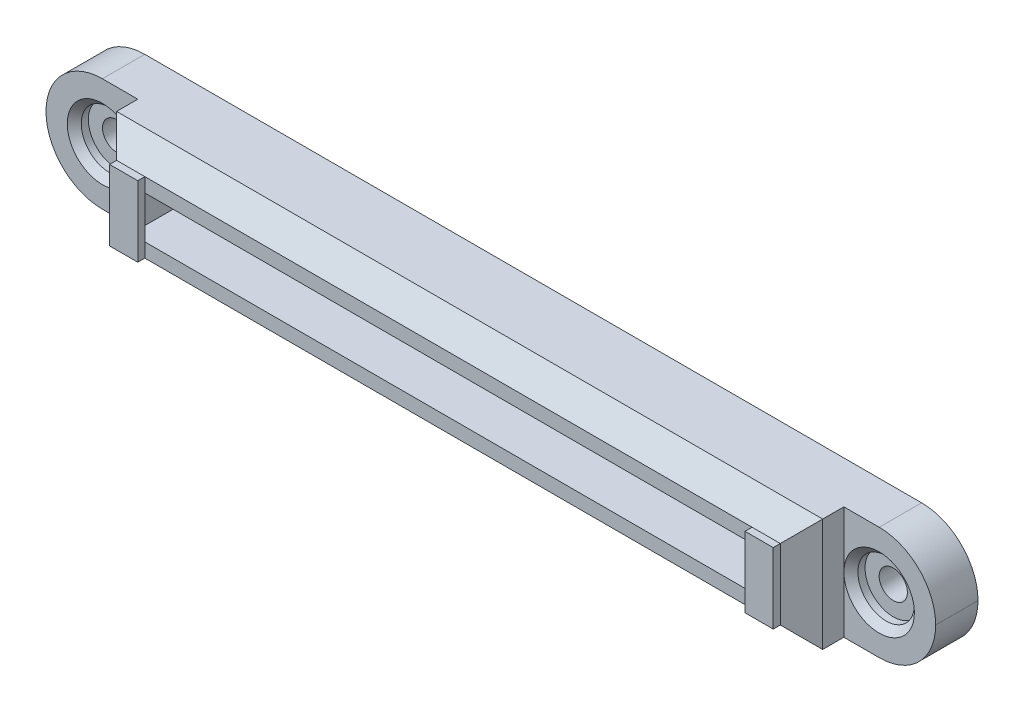
ISO-10303-21;
HEADER;
FILE_DESCRIPTION(('STEP AP214'),'2;1');
FILE_NAME('part.step','',(''),(''),'','','');
FILE_SCHEMA(('AUTOMOTIVE_DESIGN { 1 0 10303 214 1 1 1 1 }'));
ENDSEC;
DATA;
#1=APPLICATION_CONTEXT('core data for automotive mechanical design processes');
#2=APPLICATION_PROTOCOL_DEFINITION('international standard','automotive_design',2000,#1);
#3=PRODUCT_CONTEXT('',#1,'mechanical');
#4=PRODUCT('Part','Part','',(#3));
#5=PRODUCT_RELATED_PRODUCT_CATEGORY('part','',(#4));
#6=PRODUCT_DEFINITION_FORMATION('','',#4);
#7=PRODUCT_DEFINITION_CONTEXT('part definition',#1,'design');
#8=PRODUCT_DEFINITION('design','',#6,#7);
#9=PRODUCT_DEFINITION_SHAPE('','',#8);
#10=(LENGTH_UNIT() NAMED_UNIT(*) SI_UNIT(.MILLI.,.METRE.));
#11=(NAMED_UNIT(*) PLANE_ANGLE_UNIT() SI_UNIT($,.RADIAN.));
#12=(NAMED_UNIT(*) SI_UNIT($,.STERADIAN.) SOLID_ANGLE_UNIT());
#13=UNCERTAINTY_MEASURE_WITH_UNIT(LENGTH_MEASURE(1.E-05),#10,'distance_accuracy_value','');
#14=(GEOMETRIC_REPRESENTATION_CONTEXT(3) GLOBAL_UNCERTAINTY_ASSIGNED_CONTEXT((#13)) GLOBAL_UNIT_ASSIGNED_CONTEXT((#10,
#11,#12)) REPRESENTATION_CONTEXT('',''));
#15=CARTESIAN_POINT('',(0.,0.,0.));
#16=DIRECTION('',(0.,0.,1.));
#17=DIRECTION('',(1.,0.,0.));
#18=AXIS2_PLACEMENT_3D('',#15,#16,#17);
#19=CARTESIAN_POINT('',(-5.,8.,0.));
#20=DIRECTION('',(0.,0.,-1.));
#21=DIRECTION('',(-1.,0.,0.));
#22=AXIS2_PLACEMENT_3D('',#19,#20,#21);
#23=CYLINDRICAL_SURFACE('',#22,2.);
#24=CARTESIAN_POINT('',(-5.00000000001,8.00000000001,0.));
#25=DIRECTION('',(0.,0.,-1.));
#26=DIRECTION('',(-1.,0.,0.));
#27=AXIS2_PLACEMENT_3D('',#24,#25,#26);
#28=CIRCLE('',#27,2.00000000001);
#29=CARTESIAN_POINT('',(-7.00000000002,8.00000000001,0.));
#30=VERTEX_POINT('',#29);
#31=EDGE_CURVE('E11',#30,#30,#28,.T.);
#32=ORIENTED_EDGE('',*,*,#31,.T.);
#33=EDGE_LOOP('',(#32));
#34=FACE_BOUND('',#33,.T.);
#35=CARTESIAN_POINT('',(-5.00000000001,8.00000000001,4.00000000001));
#36=DIRECTION('',(0.,0.,-1.));
#37=DIRECTION('',(-1.,0.,0.));
#38=AXIS2_PLACEMENT_3D('',#35,#36,#37);
#39=CIRCLE('',#38,2.00000000001);
#40=CARTESIAN_POINT('',(-7.00000000002,8.00000000001,4.00000000001));
#41=VERTEX_POINT('',#40);
#42=EDGE_CURVE('E463',#41,#41,#39,.T.);
#43=ORIENTED_EDGE('',*,*,#42,.F.);
#44=EDGE_LOOP('',(#43));
#45=FACE_BOUND('',#44,.T.);
#46=ADVANCED_FACE('F17',(#34,#45),#23,.F.);
#47=CARTESIAN_POINT('',(105.,8.,0.));
#48=DIRECTION('',(0.,0.,-1.));
#49=DIRECTION('',(-1.,0.,0.));
#50=AXIS2_PLACEMENT_3D('',#47,#48,#49);
#51=CYLINDRICAL_SURFACE('',#50,2.);
#52=CARTESIAN_POINT('',(105.00000000001,8.00000000001,0.));
#53=DIRECTION('',(0.,0.,-1.));
#54=DIRECTION('',(-1.,0.,0.));
#55=AXIS2_PLACEMENT_3D('',#52,#53,#54);
#56=CIRCLE('',#55,2.00000000001);
#57=CARTESIAN_POINT('',(103.,8.00000000001,0.));
#58=VERTEX_POINT('',#57);
#59=EDGE_CURVE('E27',#58,#58,#56,.T.);
#60=ORIENTED_EDGE('',*,*,#59,.T.);
#61=EDGE_LOOP('',(#60));
#62=FACE_BOUND('',#61,.T.);
#63=CARTESIAN_POINT('',(105.00000000001,8.00000000001,4.00000000001));
#64=DIRECTION('',(0.,0.,-1.));
#65=DIRECTION('',(-1.,0.,0.));
#66=AXIS2_PLACEMENT_3D('',#63,#64,#65);
#67=CIRCLE('',#66,2.00000000001);
#68=CARTESIAN_POINT('',(103.,8.00000000001,4.00000000001));
#69=VERTEX_POINT('',#68);
#70=EDGE_CURVE('E323',#69,#69,#67,.T.);
#71=ORIENTED_EDGE('',*,*,#70,.F.);
#72=EDGE_LOOP('',(#71));
#73=FACE_BOUND('',#72,.T.);
#74=ADVANCED_FACE('F517',(#62,#73),#51,.F.);
#75=CARTESIAN_POINT('',(-5.,8.,6.));
#76=DIRECTION('',(0.,0.,1.));
#77=DIRECTION('',(1.,0.,0.));
#78=AXIS2_PLACEMENT_3D('',#75,#76,#77);
#79=CYLINDRICAL_SURFACE('',#78,4.);
#80=CARTESIAN_POINT('',(-5.00000000001,8.00000000001,5.01000000001));
#81=DIRECTION('',(0.,0.,-1.));
#82=DIRECTION('',(1.,0.,0.));
#83=AXIS2_PLACEMENT_3D('',#80,#81,#82);
#84=CIRCLE('',#83,4.00000000001);
#85=CARTESIAN_POINT('',(-1.,8.00000000001,5.01000000001));
#86=VERTEX_POINT('',#85);
#87=EDGE_CURVE('E349',#86,#86,#84,.T.);
#88=ORIENTED_EDGE('',*,*,#87,.F.);
#89=EDGE_LOOP('',(#88));
#90=FACE_BOUND('',#89,.T.);
#91=CARTESIAN_POINT('',(-5.00000000001,8.00000000001,4.00000000001));
#92=DIRECTION('',(0.,0.,-1.));
#93=DIRECTION('',(1.,0.,0.));
#94=AXIS2_PLACEMENT_3D('',#91,#92,#93);
#95=CIRCLE('',#94,4.00000000001);
#96=CARTESIAN_POINT('',(-1.,8.00000000001,4.00000000001));
#97=VERTEX_POINT('',#96);
#98=EDGE_CURVE('E438',#97,#97,#95,.T.);
#99=ORIENTED_EDGE('',*,*,#98,.T.);
#100=EDGE_LOOP('',(#99));
#101=FACE_BOUND('',#100,.T.);
#102=ADVANCED_FACE('F513',(#90,#101),#79,.F.);
#103=CARTESIAN_POINT('',(105.,8.,6.));
#104=DIRECTION('',(0.,0.,1.));
#105=DIRECTION('',(1.,0.,0.));
#106=AXIS2_PLACEMENT_3D('',#103,#104,#105);
#107=CYLINDRICAL_SURFACE('',#106,4.);
#108=CARTESIAN_POINT('',(105.00000000001,8.00000000001,5.01000000001));
#109=DIRECTION('',(0.,0.,-1.));
#110=DIRECTION('',(1.,0.,0.));
#111=AXIS2_PLACEMENT_3D('',#108,#109,#110);
#112=CIRCLE('',#111,4.00000000001001);
#113=CARTESIAN_POINT('',(109.00000000002,8.00000000001,5.01000000001));
#114=VERTEX_POINT('',#113);
#115=EDGE_CURVE('E491',#114,#114,#112,.T.);
#116=ORIENTED_EDGE('',*,*,#115,.F.);
#117=EDGE_LOOP('',(#116));
#118=FACE_BOUND('',#117,.T.);
#119=CARTESIAN_POINT('',(105.00000000001,8.00000000001,4.00000000001));
#120=DIRECTION('',(0.,0.,-1.));
#121=DIRECTION('',(1.,0.,0.));
#122=AXIS2_PLACEMENT_3D('',#119,#120,#121);
#123=CIRCLE('',#122,4.00000000001001);
#124=CARTESIAN_POINT('',(109.00000000002,8.00000000001,4.00000000001));
#125=VERTEX_POINT('',#124);
#126=EDGE_CURVE('E433',#125,#125,#123,.T.);
#127=ORIENTED_EDGE('',*,*,#126,.T.);
#128=EDGE_LOOP('',(#127));
#129=FACE_BOUND('',#128,.T.);
#130=ADVANCED_FACE('F516',(#118,#129),#107,.F.);
#131=CARTESIAN_POINT('',(105.,8.,6.00000000002865));
#132=DIRECTION('',(0.,0.,1.));
#133=DIRECTION('',(1.,0.,0.));
#134=AXIS2_PLACEMENT_3D('',#131,#132,#133);
#135=CONICAL_SURFACE('',#134,4.98999999998205,0.785398163426158);
#136=CARTESIAN_POINT('',(105.00000000001,8.00000000001,6.00000000002046));
#137=DIRECTION('',(0.,0.,-1.));
#138=DIRECTION('',(1.,0.,0.));
#139=AXIS2_PLACEMENT_3D('',#136,#137,#138);
#140=CIRCLE('',#139,4.98999999997386);
#141=CARTESIAN_POINT('',(109.989999999984,8.00000000001,6.00000000002046));
#142=VERTEX_POINT('',#141);
#143=EDGE_CURVE('E314',#142,#142,#140,.T.);
#144=ORIENTED_EDGE('',*,*,#143,.F.);
#145=EDGE_LOOP('',(#144));
#146=FACE_BOUND('',#145,.T.);
#147=ORIENTED_EDGE('',*,*,#115,.T.);
#148=EDGE_LOOP('',(#147));
#149=FACE_BOUND('',#148,.T.);
#150=ADVANCED_FACE('F1388',(#146,#149),#135,.F.);
#151=CARTESIAN_POINT('',(-5.,8.,5.99999999997181));
#152=DIRECTION('',(0.,0.,1.));
#153=DIRECTION('',(1.,0.,0.));
#154=AXIS2_PLACEMENT_3D('',#151,#152,#153);
#155=CONICAL_SURFACE('',#154,4.9899999999684,0.785398163368739);
#156=CARTESIAN_POINT('',(-5.00000000001,8.00000000001,5.99999999998181));
#157=DIRECTION('',(0.,0.,1.));
#158=DIRECTION('',(1.,0.,0.));
#159=AXIS2_PLACEMENT_3D('',#156,#157,#158);
#160=CIRCLE('',#159,4.9899999999784);
#161=CARTESIAN_POINT('',(-0.0100000000316002,8.00000000001,5.99999999998181));
#162=VERTEX_POINT('',#161);
#163=EDGE_CURVE('E345',#162,#162,#160,.T.);
#164=ORIENTED_EDGE('',*,*,#163,.T.);
#165=EDGE_LOOP('',(#164));
#166=FACE_BOUND('',#165,.T.);
#167=ORIENTED_EDGE('',*,*,#87,.T.);
#168=EDGE_LOOP('',(#167));
#169=FACE_BOUND('',#168,.T.);
#170=ADVANCED_FACE('F511',(#166,#169),#155,.F.);
#171=CARTESIAN_POINT('',(0.,0.,0.));
#172=DIRECTION('',(0.,0.,1.));
#173=DIRECTION('',(1.,0.,0.));
#174=AXIS2_PLACEMENT_3D('',#171,#172,#173);
#175=PLANE('',#174);
#176=DIRECTION('',(0.,1.,0.));
#177=VECTOR('',#176,1.);
#178=CARTESIAN_POINT('',(-13.00000000001,7.99000000001,0.));
#179=LINE('',#178,#177);
#180=CARTESIAN_POINT('',(-13.,7.99,0.));
#181=VERTEX_POINT('',#180);
#182=CARTESIAN_POINT('',(-13.,8.01,0.));
#183=VERTEX_POINT('',#182);
#184=EDGE_CURVE('E310',#181,#183,#179,.T.);
#185=ORIENTED_EDGE('',*,*,#184,.T.);
#186=CARTESIAN_POINT('',(-5.01000000001,8.01000000001,0.));
#187=DIRECTION('',(0.,0.,1.));
#188=DIRECTION('',(1.,0.,0.));
#189=AXIS2_PLACEMENT_3D('',#186,#187,#188);
#190=CIRCLE('',#189,7.99000000001029);
#191=CARTESIAN_POINT('',(-5.01,16.,0.));
#192=VERTEX_POINT('',#191);
#193=EDGE_CURVE('E42',#192,#183,#190,.T.);
#194=ORIENTED_EDGE('',*,*,#193,.F.);
#195=DIRECTION('',(-1.,0.,0.));
#196=VECTOR('',#195,1.);
#197=CARTESIAN_POINT('',(0.,16.00000000001,0.));
#198=LINE('',#197,#196);
#199=CARTESIAN_POINT('',(105.01,16.,0.));
#200=VERTEX_POINT('',#199);
#201=EDGE_CURVE('E275',#200,#192,#198,.T.);
#202=ORIENTED_EDGE('',*,*,#201,.F.);
#203=CARTESIAN_POINT('',(105.01000000001,8.01000000000999,0.));
#204=DIRECTION('',(0.,0.,1.));
#205=DIRECTION('',(1.,0.,0.));
#206=AXIS2_PLACEMENT_3D('',#203,#204,#205);
#207=CIRCLE('',#206,7.99000000001029);
#208=CARTESIAN_POINT('',(113.,8.01,0.));
#209=VERTEX_POINT('',#208);
#210=EDGE_CURVE('E329',#209,#200,#207,.T.);
#211=ORIENTED_EDGE('',*,*,#210,.F.);
#212=DIRECTION('',(0.,-1.,0.));
#213=VECTOR('',#212,1.);
#214=CARTESIAN_POINT('',(113.00000000001,8.01000000001,0.));
#215=LINE('',#214,#213);
#216=CARTESIAN_POINT('',(113.,7.99,0.));
#217=VERTEX_POINT('',#216);
#218=EDGE_CURVE('E303',#209,#217,#215,.T.);
#219=ORIENTED_EDGE('',*,*,#218,.T.);
#220=CARTESIAN_POINT('',(105.01000000001,7.99000000001002,0.));
#221=DIRECTION('',(0.,0.,1.));
#222=DIRECTION('',(1.,0.,0.));
#223=AXIS2_PLACEMENT_3D('',#220,#221,#222);
#224=CIRCLE('',#223,7.99000000001029);
#225=CARTESIAN_POINT('',(105.01,0.,0.));
#226=VERTEX_POINT('',#225);
#227=EDGE_CURVE('E451',#226,#217,#224,.T.);
#228=ORIENTED_EDGE('',*,*,#227,.F.);
#229=DIRECTION('',(1.,0.,0.));
#230=VECTOR('',#229,1.);
#231=CARTESIAN_POINT('',(0.,0.,0.));
#232=LINE('',#231,#230);
#233=CARTESIAN_POINT('',(-5.01,0.,0.));
#234=VERTEX_POINT('',#233);
#235=EDGE_CURVE('E244',#234,#226,#232,.T.);
#236=ORIENTED_EDGE('',*,*,#235,.F.);
#237=CARTESIAN_POINT('',(-5.01000000001,7.99000000001,0.));
#238=DIRECTION('',(0.,0.,1.));
#239=DIRECTION('',(1.,0.,0.));
#240=AXIS2_PLACEMENT_3D('',#237,#238,#239);
#241=CIRCLE('',#240,7.99000000001029);
#242=EDGE_CURVE('E340',#181,#234,#241,.T.);
#243=ORIENTED_EDGE('',*,*,#242,.F.);
#244=EDGE_LOOP('',(#185,#194,#202,#211,#219,#228,#236,#243));
#245=FACE_BOUND('',#244,.T.);
#246=ORIENTED_EDGE('',*,*,#31,.F.);
#247=EDGE_LOOP('',(#246));
#248=FACE_BOUND('',#247,.T.);
#249=ORIENTED_EDGE('',*,*,#59,.F.);
#250=EDGE_LOOP('',(#249));
#251=FACE_BOUND('',#250,.T.);
#252=DIRECTION('',(0.,-1.,0.));
#253=VECTOR('',#252,1.);
#254=CARTESIAN_POINT('',(95.00000000001,0.,0.));
#255=LINE('',#254,#253);
#256=CARTESIAN_POINT('',(95.,11.,0.));
#257=VERTEX_POINT('',#256);
#258=CARTESIAN_POINT('',(95.,5.,0.));
#259=VERTEX_POINT('',#258);
#260=EDGE_CURVE('E223',#257,#259,#255,.T.);
#261=ORIENTED_EDGE('',*,*,#260,.F.);
#262=DIRECTION('',(1.,0.,0.));
#263=VECTOR('',#262,1.);
#264=CARTESIAN_POINT('',(0.,11.00000000001,0.));
#265=LINE('',#264,#263);
#266=CARTESIAN_POINT('',(5.,11.,0.));
#267=VERTEX_POINT('',#266);
#268=EDGE_CURVE('E208',#267,#257,#265,.T.);
#269=ORIENTED_EDGE('',*,*,#268,.F.);
#270=DIRECTION('',(0.,1.,0.));
#271=VECTOR('',#270,1.);
#272=CARTESIAN_POINT('',(5.00000000001,0.,0.));
#273=LINE('',#272,#271);
#274=CARTESIAN_POINT('',(5.,5.,0.));
#275=VERTEX_POINT('',#274);
#276=EDGE_CURVE('E261',#275,#267,#273,.T.);
#277=ORIENTED_EDGE('',*,*,#276,.F.);
#278=DIRECTION('',(-1.,0.,0.));
#279=VECTOR('',#278,1.);
#280=CARTESIAN_POINT('',(0.,5.00000000001,0.));
#281=LINE('',#280,#279);
#282=EDGE_CURVE('E226',#259,#275,#281,.T.);
#283=ORIENTED_EDGE('',*,*,#282,.F.);
#284=EDGE_LOOP('',(#261,#269,#277,#283));
#285=FACE_BOUND('',#284,.T.);
#286=ADVANCED_FACE('F224',(#245,#248,#251,#285),#175,.F.);
#287=CARTESIAN_POINT('',(5.,5.,12.));
#288=DIRECTION('',(0.,-1.,0.));
#289=DIRECTION('',(0.,0.,-1.));
#290=AXIS2_PLACEMENT_3D('',#287,#288,#289);
#291=PLANE('',#290);
#292=DIRECTION('',(-1.,0.,0.));
#293=VECTOR('',#292,1.);
#294=CARTESIAN_POINT('',(5.00000000001,5.00000000001,12.00000000001));
#295=LINE('',#294,#293);
#296=CARTESIAN_POINT('',(7.,5.,12.));
#297=VERTEX_POINT('',#296);
#298=CARTESIAN_POINT('',(5.,5.,12.));
#299=VERTEX_POINT('',#298);
#300=EDGE_CURVE('E299',#297,#299,#295,.T.);
#301=ORIENTED_EDGE('',*,*,#300,.F.);
#302=CARTESIAN_POINT('',(93.,5.,12.));
#303=VERTEX_POINT('',#302);
#304=EDGE_CURVE('E379',#303,#297,#295,.T.);
#305=ORIENTED_EDGE('',*,*,#304,.F.);
#306=CARTESIAN_POINT('',(95.,5.,12.));
#307=VERTEX_POINT('',#306);
#308=EDGE_CURVE('E354',#307,#303,#295,.T.);
#309=ORIENTED_EDGE('',*,*,#308,.F.);
#310=DIRECTION('',(0.,0.,1.));
#311=VECTOR('',#310,1.);
#312=CARTESIAN_POINT('',(95.00000000001,5.00000000001,12.00000000001));
#313=LINE('',#312,#311);
#314=EDGE_CURVE('E230',#259,#307,#313,.T.);
#315=ORIENTED_EDGE('',*,*,#314,.F.);
#316=ORIENTED_EDGE('',*,*,#282,.T.);
#317=DIRECTION('',(0.,0.,-1.));
#318=VECTOR('',#317,1.);
#319=CARTESIAN_POINT('',(5.00000000001,5.00000000001,12.00000000001));
#320=LINE('',#319,#318);
#321=EDGE_CURVE('E220',#299,#275,#320,.T.);
#322=ORIENTED_EDGE('',*,*,#321,.F.);
#323=EDGE_LOOP('',(#301,#305,#309,#315,#316,#322));
#324=FACE_BOUND('',#323,.T.);
#325=ADVANCED_FACE('F297',(#324),#291,.F.);
#326=CARTESIAN_POINT('',(95.,5.,12.));
#327=DIRECTION('',(1.,0.,0.));
#328=DIRECTION('',(0.,1.,0.));
#329=AXIS2_PLACEMENT_3D('',#326,#327,#328);
#330=PLANE('',#329);
#331=DIRECTION('',(0.,-1.,0.));
#332=VECTOR('',#331,1.);
#333=CARTESIAN_POINT('',(95.00000000001,5.00000000001,12.00000000001));
#334=LINE('',#333,#332);
#335=CARTESIAN_POINT('',(95.,11.,12.));
#336=VERTEX_POINT('',#335);
#337=EDGE_CURVE('E234',#336,#307,#334,.T.);
#338=ORIENTED_EDGE('',*,*,#337,.F.);
#339=DIRECTION('',(0.,0.,1.));
#340=VECTOR('',#339,1.);
#341=CARTESIAN_POINT('',(95.00000000001,11.00000000001,12.00000000001));
#342=LINE('',#341,#340);
#343=EDGE_CURVE('E213',#257,#336,#342,.T.);
#344=ORIENTED_EDGE('',*,*,#343,.F.);
#345=ORIENTED_EDGE('',*,*,#260,.T.);
#346=ORIENTED_EDGE('',*,*,#314,.T.);
#347=EDGE_LOOP('',(#338,#344,#345,#346));
#348=FACE_BOUND('',#347,.T.);
#349=ADVANCED_FACE('F232',(#348),#330,.F.);
#350=CARTESIAN_POINT('',(95.,11.,12.));
#351=DIRECTION('',(0.,1.,0.));
#352=DIRECTION('',(1.,0.,0.));
#353=AXIS2_PLACEMENT_3D('',#350,#351,#352);
#354=PLANE('',#353);
#355=ORIENTED_EDGE('',*,*,#343,.T.);
#356=DIRECTION('',(1.,0.,0.));
#357=VECTOR('',#356,1.);
#358=CARTESIAN_POINT('',(95.00000000001,11.00000000001,12.00000000001));
#359=LINE('',#358,#357);
#360=CARTESIAN_POINT('',(93.,11.,12.));
#361=VERTEX_POINT('',#360);
#362=EDGE_CURVE('E382',#361,#336,#359,.T.);
#363=ORIENTED_EDGE('',*,*,#362,.F.);
#364=CARTESIAN_POINT('',(7.,11.,12.));
#365=VERTEX_POINT('',#364);
#366=EDGE_CURVE('E355',#365,#361,#359,.T.);
#367=ORIENTED_EDGE('',*,*,#366,.F.);
#368=CARTESIAN_POINT('',(5.,11.,12.));
#369=VERTEX_POINT('',#368);
#370=EDGE_CURVE('E324',#369,#365,#359,.T.);
#371=ORIENTED_EDGE('',*,*,#370,.F.);
#372=DIRECTION('',(0.,0.,1.));
#373=VECTOR('',#372,1.);
#374=CARTESIAN_POINT('',(5.00000000001,11.00000000001,12.00000000001));
#375=LINE('',#374,#373);
#376=EDGE_CURVE('E216',#267,#369,#375,.T.);
#377=ORIENTED_EDGE('',*,*,#376,.F.);
#378=ORIENTED_EDGE('',*,*,#268,.T.);
#379=EDGE_LOOP('',(#355,#363,#367,#371,#377,#378));
#380=FACE_BOUND('',#379,.T.);
#381=ADVANCED_FACE('F210',(#380),#354,.F.);
#382=CARTESIAN_POINT('',(5.,11.,12.));
#383=DIRECTION('',(-1.,0.,0.));
#384=DIRECTION('',(0.,0.,1.));
#385=AXIS2_PLACEMENT_3D('',#382,#383,#384);
#386=PLANE('',#385);
#387=DIRECTION('',(0.,1.,0.));
#388=VECTOR('',#387,1.);
#389=CARTESIAN_POINT('',(5.00000000001,11.00000000001,12.00000000001));
#390=LINE('',#389,#388);
#391=EDGE_CURVE('E292',#299,#369,#390,.T.);
#392=ORIENTED_EDGE('',*,*,#391,.F.);
#393=ORIENTED_EDGE('',*,*,#321,.T.);
#394=ORIENTED_EDGE('',*,*,#276,.T.);
#395=ORIENTED_EDGE('',*,*,#376,.T.);
#396=EDGE_LOOP('',(#392,#393,#394,#395));
#397=FACE_BOUND('',#396,.T.);
#398=ADVANCED_FACE('F290',(#397),#386,.F.);
#399=CARTESIAN_POINT('',(-5.01,7.99,-0.02));
#400=DIRECTION('',(0.,0.,1.));
#401=DIRECTION('',(1.,0.,0.));
#402=AXIS2_PLACEMENT_3D('',#399,#400,#401);
#403=CYLINDRICAL_SURFACE('',#402,7.99000000000029);
#404=DIRECTION('',(0.,0.,-1.));
#405=VECTOR('',#404,1.);
#406=CARTESIAN_POINT('',(-5.01000000001,-1.00008792966355E-11,0.99000000001));
#407=LINE('',#406,#405);
#408=CARTESIAN_POINT('',(-5.01,0.,6.));
#409=VERTEX_POINT('',#408);
#410=EDGE_CURVE('E341',#409,#234,#407,.T.);
#411=ORIENTED_EDGE('',*,*,#410,.F.);
#412=CARTESIAN_POINT('',(-5.01000000001,7.99000000001,6.00000000001));
#413=DIRECTION('',(0.,0.,-1.));
#414=DIRECTION('',(1.,0.,0.));
#415=AXIS2_PLACEMENT_3D('',#412,#413,#414);
#416=CIRCLE('',#415,7.99000000001);
#417=CARTESIAN_POINT('',(-13.,7.99,6.));
#418=VERTEX_POINT('',#417);
#419=EDGE_CURVE('E262',#409,#418,#416,.T.);
#420=ORIENTED_EDGE('',*,*,#419,.T.);
#421=DIRECTION('',(0.,0.,1.));
#422=VECTOR('',#421,1.);
#423=CARTESIAN_POINT('',(-13.00000000001,7.99000000001,0.99000000001));
#424=LINE('',#423,#422);
#425=EDGE_CURVE('E269',#181,#418,#424,.T.);
#426=ORIENTED_EDGE('',*,*,#425,.F.);
#427=ORIENTED_EDGE('',*,*,#242,.T.);
#428=EDGE_LOOP('',(#411,#420,#426,#427));
#429=FACE_BOUND('',#428,.T.);
#430=ADVANCED_FACE('F550',(#429),#403,.T.);
#431=CARTESIAN_POINT('',(-5.01,8.01,-0.02));
#432=DIRECTION('',(0.,0.,1.));
#433=DIRECTION('',(1.,0.,0.));
#434=AXIS2_PLACEMENT_3D('',#431,#432,#433);
#435=CYLINDRICAL_SURFACE('',#434,7.99000000000029);
#436=DIRECTION('',(0.,0.,-1.));
#437=VECTOR('',#436,1.);
#438=CARTESIAN_POINT('',(-13.00000000001,8.01000000001,0.99000000001));
#439=LINE('',#438,#437);
#440=CARTESIAN_POINT('',(-13.,8.01,6.));
#441=VERTEX_POINT('',#440);
#442=EDGE_CURVE('E265',#441,#183,#439,.T.);
#443=ORIENTED_EDGE('',*,*,#442,.F.);
#444=CARTESIAN_POINT('',(-5.01000000001,8.01000000001,6.00000000001));
#445=DIRECTION('',(0.,0.,-1.));
#446=DIRECTION('',(1.,0.,0.));
#447=AXIS2_PLACEMENT_3D('',#444,#445,#446);
#448=CIRCLE('',#447,7.99000000001);
#449=CARTESIAN_POINT('',(-5.01,16.,6.));
#450=VERTEX_POINT('',#449);
#451=EDGE_CURVE('E336',#441,#450,#448,.T.);
#452=ORIENTED_EDGE('',*,*,#451,.T.);
#453=DIRECTION('',(0.,0.,1.));
#454=VECTOR('',#453,1.);
#455=CARTESIAN_POINT('',(-5.01000000001,16.00000000001,0.99000000001));
#456=LINE('',#455,#454);
#457=EDGE_CURVE('E250',#192,#450,#456,.T.);
#458=ORIENTED_EDGE('',*,*,#457,.F.);
#459=ORIENTED_EDGE('',*,*,#193,.T.);
#460=EDGE_LOOP('',(#443,#452,#458,#459));
#461=FACE_BOUND('',#460,.T.);
#462=ADVANCED_FACE('F476',(#461),#435,.T.);
#463=CARTESIAN_POINT('',(105.01,16.,2.));
#464=DIRECTION('',(0.,1.,0.));
#465=DIRECTION('',(1.,0.,0.));
#466=AXIS2_PLACEMENT_3D('',#463,#464,#465);
#467=PLANE('',#466);
#468=DIRECTION('',(0.,0.,-1.));
#469=VECTOR('',#468,1.);
#470=CARTESIAN_POINT('',(100.00000000001,16.00000000001,2.00000000001));
#471=LINE('',#470,#469);
#472=CARTESIAN_POINT('',(100.,16.,9.));
#473=VERTEX_POINT('',#472);
#474=CARTESIAN_POINT('',(100.,16.,6.));
#475=VERTEX_POINT('',#474);
#476=EDGE_CURVE('E405',#473,#475,#471,.T.);
#477=ORIENTED_EDGE('',*,*,#476,.T.);
#478=DIRECTION('',(1.,0.,0.));
#479=VECTOR('',#478,1.);
#480=CARTESIAN_POINT('',(105.01000000001,16.00000000001,6.00000000001));
#481=LINE('',#480,#479);
#482=CARTESIAN_POINT('',(105.01,16.,6.));
#483=VERTEX_POINT('',#482);
#484=EDGE_CURVE('E252',#475,#483,#481,.T.);
#485=ORIENTED_EDGE('',*,*,#484,.T.);
#486=DIRECTION('',(0.,0.,-1.));
#487=VECTOR('',#486,1.);
#488=CARTESIAN_POINT('',(105.01000000001,16.00000000001,2.00000000001));
#489=LINE('',#488,#487);
#490=EDGE_CURVE('E271',#483,#200,#489,.T.);
#491=ORIENTED_EDGE('',*,*,#490,.T.);
#492=ORIENTED_EDGE('',*,*,#201,.T.);
#493=ORIENTED_EDGE('',*,*,#457,.T.);
#494=CARTESIAN_POINT('',(0.,16.,6.));
#495=VERTEX_POINT('',#494);
#496=EDGE_CURVE('E246',#450,#495,#481,.T.);
#497=ORIENTED_EDGE('',*,*,#496,.T.);
#498=DIRECTION('',(0.,0.,1.));
#499=VECTOR('',#498,1.);
#500=CARTESIAN_POINT('',(0.,16.00000000001,2.00000000001));
#501=LINE('',#500,#499);
#502=CARTESIAN_POINT('',(0.,16.,9.));
#503=VERTEX_POINT('',#502);
#504=EDGE_CURVE('E251',#495,#503,#501,.T.);
#505=ORIENTED_EDGE('',*,*,#504,.T.);
#506=DIRECTION('',(1.,0.,0.));
#507=VECTOR('',#506,1.);
#508=CARTESIAN_POINT('',(105.01000000001,16.00000000001,9.00000000001));
#509=LINE('',#508,#507);
#510=EDGE_CURVE('E325',#503,#473,#509,.T.);
#511=ORIENTED_EDGE('',*,*,#510,.T.);
#512=EDGE_LOOP('',(#477,#485,#491,#492,#493,#497,#505,#511));
#513=FACE_BOUND('',#512,.T.);
#514=ADVANCED_FACE('F481',(#513),#467,.T.);
#515=CARTESIAN_POINT('',(105.01,8.01,-0.02));
#516=DIRECTION('',(0.,0.,1.));
#517=DIRECTION('',(1.,0.,0.));
#518=AXIS2_PLACEMENT_3D('',#515,#516,#517);
#519=CYLINDRICAL_SURFACE('',#518,7.99000000000029);
#520=ORIENTED_EDGE('',*,*,#490,.F.);
#521=CARTESIAN_POINT('',(105.01000000001,8.01000000001,6.00000000001));
#522=DIRECTION('',(0.,0.,1.));
#523=DIRECTION('',(1.,0.,0.));
#524=AXIS2_PLACEMENT_3D('',#521,#522,#523);
#525=CIRCLE('',#524,7.99000000001);
#526=CARTESIAN_POINT('',(113.,8.01,6.));
#527=VERTEX_POINT('',#526);
#528=EDGE_CURVE('E366',#527,#483,#525,.T.);
#529=ORIENTED_EDGE('',*,*,#528,.F.);
#530=DIRECTION('',(0.,0.,1.));
#531=VECTOR('',#530,1.);
#532=CARTESIAN_POINT('',(113.00000000001,8.01000000001,0.99000000001));
#533=LINE('',#532,#531);
#534=EDGE_CURVE('E398',#209,#527,#533,.T.);
#535=ORIENTED_EDGE('',*,*,#534,.F.);
#536=ORIENTED_EDGE('',*,*,#210,.T.);
#537=EDGE_LOOP('',(#520,#529,#535,#536));
#538=FACE_BOUND('',#537,.T.);
#539=ADVANCED_FACE('F586',(#538),#519,.T.);
#540=CARTESIAN_POINT('',(105.01,7.99,-0.02));
#541=DIRECTION('',(0.,0.,1.));
#542=DIRECTION('',(1.,0.,0.));
#543=AXIS2_PLACEMENT_3D('',#540,#541,#542);
#544=CYLINDRICAL_SURFACE('',#543,7.99000000000029);
#545=DIRECTION('',(0.,0.,1.));
#546=VECTOR('',#545,1.);
#547=CARTESIAN_POINT('',(113.00000000001,7.99000000001,0.99000000001));
#548=LINE('',#547,#546);
#549=CARTESIAN_POINT('',(113.,7.99,6.));
#550=VERTEX_POINT('',#549);
#551=EDGE_CURVE('E532',#217,#550,#548,.T.);
#552=ORIENTED_EDGE('',*,*,#551,.T.);
#553=CARTESIAN_POINT('',(105.01000000001,7.99000000001,6.00000000001));
#554=DIRECTION('',(0.,0.,1.));
#555=DIRECTION('',(1.,0.,0.));
#556=AXIS2_PLACEMENT_3D('',#553,#554,#555);
#557=CIRCLE('',#556,7.99000000001);
#558=CARTESIAN_POINT('',(105.01,0.,6.));
#559=VERTEX_POINT('',#558);
#560=EDGE_CURVE('E367',#559,#550,#557,.T.);
#561=ORIENTED_EDGE('',*,*,#560,.F.);
#562=DIRECTION('',(0.,0.,-1.));
#563=VECTOR('',#562,1.);
#564=CARTESIAN_POINT('',(105.01000000001,-1.00008792966355E-11,0.99000000001));
#565=LINE('',#564,#563);
#566=EDGE_CURVE('E454',#559,#226,#565,.T.);
#567=ORIENTED_EDGE('',*,*,#566,.T.);
#568=ORIENTED_EDGE('',*,*,#227,.T.);
#569=EDGE_LOOP('',(#552,#561,#567,#568));
#570=FACE_BOUND('',#569,.T.);
#571=ADVANCED_FACE('F1483',(#570),#544,.T.);
#572=CARTESIAN_POINT('',(105.01,0.,6.));
#573=DIRECTION('',(0.,-1.,0.));
#574=DIRECTION('',(0.,0.,-1.));
#575=AXIS2_PLACEMENT_3D('',#572,#573,#574);
#576=PLANE('',#575);
#577=ORIENTED_EDGE('',*,*,#566,.F.);
#578=DIRECTION('',(-1.,0.,0.));
#579=VECTOR('',#578,1.);
#580=CARTESIAN_POINT('',(105.01000000001,0.,6.00000000001));
#581=LINE('',#580,#579);
#582=CARTESIAN_POINT('',(100.,0.,6.));
#583=VERTEX_POINT('',#582);
#584=EDGE_CURVE('E455',#559,#583,#581,.T.);
#585=ORIENTED_EDGE('',*,*,#584,.T.);
#586=DIRECTION('',(0.,0.,1.));
#587=VECTOR('',#586,1.);
#588=CARTESIAN_POINT('',(100.00000000001,0.,6.00000000001));
#589=LINE('',#588,#587);
#590=CARTESIAN_POINT('',(100.,0.,9.));
#591=VERTEX_POINT('',#590);
#592=EDGE_CURVE('E617',#583,#591,#589,.T.);
#593=ORIENTED_EDGE('',*,*,#592,.T.);
#594=DIRECTION('',(-1.,0.,0.));
#595=VECTOR('',#594,1.);
#596=CARTESIAN_POINT('',(105.01000000001,0.,9.00000000001));
#597=LINE('',#596,#595);
#598=CARTESIAN_POINT('',(0.,0.,9.));
#599=VERTEX_POINT('',#598);
#600=EDGE_CURVE('E256',#591,#599,#597,.T.);
#601=ORIENTED_EDGE('',*,*,#600,.T.);
#602=DIRECTION('',(0.,0.,-1.));
#603=VECTOR('',#602,1.);
#604=CARTESIAN_POINT('',(0.,0.,6.00000000001));
#605=LINE('',#604,#603);
#606=CARTESIAN_POINT('',(0.,0.,6.));
#607=VERTEX_POINT('',#606);
#608=EDGE_CURVE('E253',#599,#607,#605,.T.);
#609=ORIENTED_EDGE('',*,*,#608,.T.);
#610=EDGE_CURVE('E257',#607,#409,#581,.T.);
#611=ORIENTED_EDGE('',*,*,#610,.T.);
#612=ORIENTED_EDGE('',*,*,#410,.T.);
#613=ORIENTED_EDGE('',*,*,#235,.T.);
#614=EDGE_LOOP('',(#577,#585,#593,#601,#609,#611,#612,#613));
#615=FACE_BOUND('',#614,.T.);
#616=ADVANCED_FACE('F554',(#615),#576,.T.);
#617=CARTESIAN_POINT('',(-1.,8.,4.));
#618=DIRECTION('',(0.,0.,-1.));
#619=DIRECTION('',(0.,-1.,0.));
#620=AXIS2_PLACEMENT_3D('',#617,#618,#619);
#621=PLANE('',#620);
#622=ORIENTED_EDGE('',*,*,#98,.F.);
#623=EDGE_LOOP('',(#622));
#624=FACE_BOUND('',#623,.T.);
#625=ORIENTED_EDGE('',*,*,#42,.T.);
#626=EDGE_LOOP('',(#625));
#627=FACE_BOUND('',#626,.T.);
#628=ADVANCED_FACE('F1501',(#624,#627),#621,.F.);
#629=CARTESIAN_POINT('',(109.,8.,4.));
#630=DIRECTION('',(0.,0.,-1.));
#631=DIRECTION('',(0.,-1.,0.));
#632=AXIS2_PLACEMENT_3D('',#629,#630,#631);
#633=PLANE('',#632);
#634=ORIENTED_EDGE('',*,*,#126,.F.);
#635=EDGE_LOOP('',(#634));
#636=FACE_BOUND('',#635,.T.);
#637=ORIENTED_EDGE('',*,*,#70,.T.);
#638=EDGE_LOOP('',(#637));
#639=FACE_BOUND('',#638,.T.);
#640=ADVANCED_FACE('F1510',(#636,#639),#633,.F.);
#641=CARTESIAN_POINT('',(3.,3.,12.));
#642=DIRECTION('',(0.,0.,-1.));
#643=DIRECTION('',(0.,-1.,0.));
#644=AXIS2_PLACEMENT_3D('',#641,#642,#643);
#645=PLANE('',#644);
#646=ORIENTED_EDGE('',*,*,#391,.T.);
#647=ORIENTED_EDGE('',*,*,#370,.T.);
#648=DIRECTION('',(0.,-1.,0.));
#649=VECTOR('',#648,1.);
#650=CARTESIAN_POINT('',(7.00000000001,3.00000000001,12.00000000001));
#651=LINE('',#650,#649);
#652=EDGE_CURVE('E439',#365,#297,#651,.T.);
#653=ORIENTED_EDGE('',*,*,#652,.T.);
#654=ORIENTED_EDGE('',*,*,#300,.T.);
#655=EDGE_LOOP('',(#646,#647,#653,#654));
#656=FACE_BOUND('',#655,.T.);
#657=ADVANCED_FACE('F1518',(#656),#645,.T.);
#658=CARTESIAN_POINT('',(0.,0.,12.));
#659=DIRECTION('',(0.,0.,-1.));
#660=DIRECTION('',(0.,-1.,0.));
#661=AXIS2_PLACEMENT_3D('',#658,#659,#660);
#662=PLANE('',#661);
#663=DIRECTION('',(0.,1.,0.));
#664=VECTOR('',#663,1.);
#665=CARTESIAN_POINT('',(7.00000000001,0.,12.00000000001));
#666=LINE('',#665,#664);
#667=CARTESIAN_POINT('',(7.,3.,12.));
#668=VERTEX_POINT('',#667);
#669=EDGE_CURVE('E388',#668,#297,#666,.T.);
#670=ORIENTED_EDGE('',*,*,#669,.F.);
#671=DIRECTION('',(-1.,0.,0.));
#672=VECTOR('',#671,1.);
#673=CARTESIAN_POINT('',(0.,3.00000000001,12.00000000001));
#674=LINE('',#673,#672);
#675=CARTESIAN_POINT('',(93.,3.,12.));
#676=VERTEX_POINT('',#675);
#677=EDGE_CURVE('E393',#676,#668,#674,.T.);
#678=ORIENTED_EDGE('',*,*,#677,.F.);
#679=DIRECTION('',(0.,-1.,0.));
#680=VECTOR('',#679,1.);
#681=CARTESIAN_POINT('',(93.00000000001,0.,12.00000000001));
#682=LINE('',#681,#680);
#683=EDGE_CURVE('E360',#303,#676,#682,.T.);
#684=ORIENTED_EDGE('',*,*,#683,.F.);
#685=ORIENTED_EDGE('',*,*,#304,.T.);
#686=EDGE_LOOP('',(#670,#678,#684,#685));
#687=FACE_BOUND('',#686,.T.);
#688=ADVANCED_FACE('F1529',(#687),#662,.F.);
#689=CARTESIAN_POINT('',(93.,3.,12.));
#690=DIRECTION('',(0.,0.,-1.));
#691=DIRECTION('',(0.,-1.,0.));
#692=AXIS2_PLACEMENT_3D('',#689,#690,#691);
#693=PLANE('',#692);
#694=ORIENTED_EDGE('',*,*,#362,.T.);
#695=ORIENTED_EDGE('',*,*,#337,.T.);
#696=ORIENTED_EDGE('',*,*,#308,.T.);
#697=DIRECTION('',(0.,1.,0.));
#698=VECTOR('',#697,1.);
#699=CARTESIAN_POINT('',(93.00000000001,3.00000000001,12.00000000001));
#700=LINE('',#699,#698);
#701=EDGE_CURVE('E350',#303,#361,#700,.T.);
#702=ORIENTED_EDGE('',*,*,#701,.T.);
#703=EDGE_LOOP('',(#694,#695,#696,#702));
#704=FACE_BOUND('',#703,.T.);
#705=ADVANCED_FACE('F1539',(#704),#693,.T.);
#706=ORIENTED_EDGE('',*,*,#366,.T.);
#707=CARTESIAN_POINT('',(93.,13.,12.));
#708=VERTEX_POINT('',#707);
#709=EDGE_CURVE('E356',#708,#361,#682,.T.);
#710=ORIENTED_EDGE('',*,*,#709,.F.);
#711=DIRECTION('',(1.,0.,0.));
#712=VECTOR('',#711,1.);
#713=CARTESIAN_POINT('',(0.,13.00000000001,12.00000000001));
#714=LINE('',#713,#712);
#715=CARTESIAN_POINT('',(7.,13.,12.));
#716=VERTEX_POINT('',#715);
#717=EDGE_CURVE('E330',#716,#708,#714,.T.);
#718=ORIENTED_EDGE('',*,*,#717,.F.);
#719=EDGE_CURVE('E384',#365,#716,#666,.T.);
#720=ORIENTED_EDGE('',*,*,#719,.F.);
#721=EDGE_LOOP('',(#706,#710,#718,#720));
#722=FACE_BOUND('',#721,.T.);
#723=ADVANCED_FACE('F671',(#722),#662,.F.);
#724=CARTESIAN_POINT('',(-13.,7.99,0.));
#725=DIRECTION('',(1.,0.,0.));
#726=DIRECTION('',(0.,1.,0.));
#727=AXIS2_PLACEMENT_3D('',#724,#725,#726);
#728=PLANE('',#727);
#729=ORIENTED_EDGE('',*,*,#425,.T.);
#730=DIRECTION('',(0.,-1.,0.));
#731=VECTOR('',#730,1.);
#732=CARTESIAN_POINT('',(-13.00000000001,7.99000000001,6.00000000001));
#733=LINE('',#732,#731);
#734=EDGE_CURVE('E335',#441,#418,#733,.T.);
#735=ORIENTED_EDGE('',*,*,#734,.F.);
#736=ORIENTED_EDGE('',*,*,#442,.T.);
#737=ORIENTED_EDGE('',*,*,#184,.F.);
#738=EDGE_LOOP('',(#729,#735,#736,#737));
#739=FACE_BOUND('',#738,.T.);
#740=ADVANCED_FACE('F475',(#739),#728,.F.);
#741=CARTESIAN_POINT('',(100.,16.,6.));
#742=DIRECTION('',(0.,0.,1.));
#743=DIRECTION('',(1.,0.,0.));
#744=AXIS2_PLACEMENT_3D('',#741,#742,#743);
#745=PLANE('',#744);
#746=DIRECTION('',(0.,1.,0.));
#747=VECTOR('',#746,1.);
#748=CARTESIAN_POINT('',(113.00000000001,16.00000000001,6.00000000001));
#749=LINE('',#748,#747);
#750=EDGE_CURVE('E270',#550,#527,#749,.T.);
#751=ORIENTED_EDGE('',*,*,#750,.T.);
#752=ORIENTED_EDGE('',*,*,#528,.T.);
#753=ORIENTED_EDGE('',*,*,#484,.F.);
#754=DIRECTION('',(0.,-1.,0.));
#755=VECTOR('',#754,1.);
#756=CARTESIAN_POINT('',(100.00000000001,16.00000000001,6.00000000001));
#757=LINE('',#756,#755);
#758=EDGE_CURVE('E362',#475,#583,#757,.T.);
#759=ORIENTED_EDGE('',*,*,#758,.T.);
#760=ORIENTED_EDGE('',*,*,#584,.F.);
#761=ORIENTED_EDGE('',*,*,#560,.T.);
#762=EDGE_LOOP('',(#751,#752,#753,#759,#760,#761));
#763=FACE_BOUND('',#762,.T.);
#764=ORIENTED_EDGE('',*,*,#143,.T.);
#765=EDGE_LOOP('',(#764));
#766=FACE_BOUND('',#765,.T.);
#767=ADVANCED_FACE('F592',(#763,#766),#745,.T.);
#768=CARTESIAN_POINT('',(100.,0.,0.));
#769=DIRECTION('',(-1.,0.,0.));
#770=DIRECTION('',(0.,0.,1.));
#771=AXIS2_PLACEMENT_3D('',#768,#769,#770);
#772=PLANE('',#771);
#773=ORIENTED_EDGE('',*,*,#592,.F.);
#774=ORIENTED_EDGE('',*,*,#758,.F.);
#775=ORIENTED_EDGE('',*,*,#476,.F.);
#776=DIRECTION('',(0.,1.,0.));
#777=VECTOR('',#776,1.);
#778=CARTESIAN_POINT('',(100.00000000001,0.,9.00000000001));
#779=LINE('',#778,#777);
#780=EDGE_CURVE('E397',#591,#473,#779,.T.);
#781=ORIENTED_EDGE('',*,*,#780,.F.);
#782=EDGE_LOOP('',(#773,#774,#775,#781));
#783=FACE_BOUND('',#782,.T.);
#784=ADVANCED_FACE('F1573',(#783),#772,.F.);
#785=CARTESIAN_POINT('',(14.,16.,9.));
#786=DIRECTION('',(0.,0.707106781186548,0.707106781186548));
#787=DIRECTION('',(1.,0.,0.));
#788=AXIS2_PLACEMENT_3D('',#785,#786,#787);
#789=PLANE('',#788);
#790=DIRECTION('',(1.,0.,0.));
#791=VECTOR('',#790,1.);
#792=CARTESIAN_POINT('',(14.00000000001,13.00000000001,12.00000000001));
#793=LINE('',#792,#791);
#794=CARTESIAN_POINT('',(97.,13.,12.));
#795=VERTEX_POINT('',#794);
#796=EDGE_CURVE('E679',#708,#795,#793,.T.);
#797=ORIENTED_EDGE('',*,*,#796,.T.);
#798=DIRECTION('',(0.577350269189626,0.577350269189626,-0.577350269189626));
#799=VECTOR('',#798,1.);
#800=CARTESIAN_POINT('',(97.00000000001,13.00000000001,12.00000000001));
#801=LINE('',#800,#799);
#802=EDGE_CURVE('E683',#795,#473,#801,.T.);
#803=ORIENTED_EDGE('',*,*,#802,.T.);
#804=ORIENTED_EDGE('',*,*,#510,.F.);
#805=DIRECTION('',(0.577350269189627,-0.577350269189625,0.577350269189625));
#806=VECTOR('',#805,1.);
#807=CARTESIAN_POINT('',(-1.00069388939039E-11,16.00000000001,9.00000000001));
#808=LINE('',#807,#806);
#809=CARTESIAN_POINT('',(3.,13.,12.));
#810=VERTEX_POINT('',#809);
#811=EDGE_CURVE('E677',#503,#810,#808,.T.);
#812=ORIENTED_EDGE('',*,*,#811,.T.);
#813=EDGE_CURVE('E334',#810,#716,#793,.T.);
#814=ORIENTED_EDGE('',*,*,#813,.T.);
#815=ORIENTED_EDGE('',*,*,#717,.T.);
#816=EDGE_LOOP('',(#797,#803,#804,#812,#814,#815));
#817=FACE_BOUND('',#816,.T.);
#818=ADVANCED_FACE('F675',(#817),#789,.T.);
#819=CARTESIAN_POINT('',(0.,16.,0.));
#820=DIRECTION('',(1.,0.,0.));
#821=DIRECTION('',(0.,1.,0.));
#822=AXIS2_PLACEMENT_3D('',#819,#820,#821);
#823=PLANE('',#822);
#824=ORIENTED_EDGE('',*,*,#504,.F.);
#825=DIRECTION('',(0.,1.,0.));
#826=VECTOR('',#825,1.);
#827=CARTESIAN_POINT('',(0.,16.00000000001,6.00000000001));
#828=LINE('',#827,#826);
#829=EDGE_CURVE('E401',#607,#495,#828,.T.);
#830=ORIENTED_EDGE('',*,*,#829,.F.);
#831=ORIENTED_EDGE('',*,*,#608,.F.);
#832=DIRECTION('',(0.,-1.,0.));
#833=VECTOR('',#832,1.);
#834=CARTESIAN_POINT('',(0.,16.00000000001,9.00000000001));
#835=LINE('',#834,#833);
#836=EDGE_CURVE('E542',#503,#599,#835,.T.);
#837=ORIENTED_EDGE('',*,*,#836,.F.);
#838=EDGE_LOOP('',(#824,#830,#831,#837));
#839=FACE_BOUND('',#838,.T.);
#840=ADVANCED_FACE('F1592',(#839),#823,.F.);
#841=CARTESIAN_POINT('',(0.,16.,6.));
#842=DIRECTION('',(0.,0.,-1.));
#843=DIRECTION('',(0.,-1.,0.));
#844=AXIS2_PLACEMENT_3D('',#841,#842,#843);
#845=PLANE('',#844);
#846=ORIENTED_EDGE('',*,*,#734,.T.);
#847=ORIENTED_EDGE('',*,*,#419,.F.);
#848=ORIENTED_EDGE('',*,*,#610,.F.);
#849=ORIENTED_EDGE('',*,*,#829,.T.);
#850=ORIENTED_EDGE('',*,*,#496,.F.);
#851=ORIENTED_EDGE('',*,*,#451,.F.);
#852=EDGE_LOOP('',(#846,#847,#848,#849,#850,#851));
#853=FACE_BOUND('',#852,.T.);
#854=ORIENTED_EDGE('',*,*,#163,.F.);
#855=EDGE_LOOP('',(#854));
#856=FACE_BOUND('',#855,.T.);
#857=ADVANCED_FACE('F477',(#853,#856),#845,.F.);
#858=CARTESIAN_POINT('',(113.,8.01,6.));
#859=DIRECTION('',(-1.,0.,0.));
#860=DIRECTION('',(0.,0.,1.));
#861=AXIS2_PLACEMENT_3D('',#858,#859,#860);
#862=PLANE('',#861);
#863=ORIENTED_EDGE('',*,*,#750,.F.);
#864=ORIENTED_EDGE('',*,*,#551,.F.);
#865=ORIENTED_EDGE('',*,*,#218,.F.);
#866=ORIENTED_EDGE('',*,*,#534,.T.);
#867=EDGE_LOOP('',(#863,#864,#865,#866));
#868=FACE_BOUND('',#867,.T.);
#869=ADVANCED_FACE('F1610',(#868),#862,.F.);
#870=CARTESIAN_POINT('',(0.,1.5,10.5));
#871=DIRECTION('',(0.,-0.707106781186548,0.707106781186548));
#872=DIRECTION('',(-1.,0.,0.));
#873=AXIS2_PLACEMENT_3D('',#870,#871,#872);
#874=PLANE('',#873);
#875=ORIENTED_EDGE('',*,*,#677,.T.);
#876=CARTESIAN_POINT('',(3.,3.,12.));
#877=VERTEX_POINT('',#876);
#878=EDGE_CURVE('E389',#668,#877,#674,.T.);
#879=ORIENTED_EDGE('',*,*,#878,.T.);
#880=DIRECTION('',(-0.577350269189626,-0.577350269189626,-0.577350269189626));
#881=VECTOR('',#880,1.);
#882=CARTESIAN_POINT('',(3.00000000001,3.00000000001,12.00000000001));
#883=LINE('',#882,#881);
#884=EDGE_CURVE('E394',#877,#599,#883,.T.);
#885=ORIENTED_EDGE('',*,*,#884,.T.);
#886=ORIENTED_EDGE('',*,*,#600,.F.);
#887=DIRECTION('',(-0.577350269189626,0.577350269189626,0.577350269189626));
#888=VECTOR('',#887,1.);
#889=CARTESIAN_POINT('',(100.00000000001,1.0000433680869E-11,9.00000000001));
#890=LINE('',#889,#888);
#891=CARTESIAN_POINT('',(97.,3.,12.));
#892=VERTEX_POINT('',#891);
#893=EDGE_CURVE('E629',#591,#892,#890,.T.);
#894=ORIENTED_EDGE('',*,*,#893,.T.);
#895=EDGE_CURVE('E387',#892,#676,#674,.T.);
#896=ORIENTED_EDGE('',*,*,#895,.T.);
#897=EDGE_LOOP('',(#875,#879,#885,#886,#894,#896));
#898=FACE_BOUND('',#897,.T.);
#899=ADVANCED_FACE('F1620',(#898),#874,.T.);
#900=CARTESIAN_POINT('',(7.,3.,12.));
#901=DIRECTION('',(-1.,0.,0.));
#902=DIRECTION('',(0.,0.,1.));
#903=AXIS2_PLACEMENT_3D('',#900,#901,#902);
#904=PLANE('',#903);
#905=ORIENTED_EDGE('',*,*,#652,.F.);
#906=ORIENTED_EDGE('',*,*,#719,.T.);
#907=DIRECTION('',(0.,0.,-1.));
#908=VECTOR('',#907,1.);
#909=CARTESIAN_POINT('',(7.00000000001,13.00000000001,12.00000000001));
#910=LINE('',#909,#908);
#911=CARTESIAN_POINT('',(7.,13.,13.));
#912=VERTEX_POINT('',#911);
#913=EDGE_CURVE('E626',#912,#716,#910,.T.);
#914=ORIENTED_EDGE('',*,*,#913,.F.);
#915=DIRECTION('',(0.,1.,0.));
#916=VECTOR('',#915,1.);
#917=CARTESIAN_POINT('',(7.00000000001,3.00000000001,13.00000000001));
#918=LINE('',#917,#916);
#919=CARTESIAN_POINT('',(7.,3.,13.));
#920=VERTEX_POINT('',#919);
#921=EDGE_CURVE('E378',#920,#912,#918,.T.);
#922=ORIENTED_EDGE('',*,*,#921,.F.);
#923=DIRECTION('',(0.,0.,1.));
#924=VECTOR('',#923,1.);
#925=CARTESIAN_POINT('',(7.00000000001,3.00000000001,12.00000000001));
#926=LINE('',#925,#924);
#927=EDGE_CURVE('E377',#668,#920,#926,.T.);
#928=ORIENTED_EDGE('',*,*,#927,.F.);
#929=ORIENTED_EDGE('',*,*,#669,.T.);
#930=EDGE_LOOP('',(#905,#906,#914,#922,#928,#929));
#931=FACE_BOUND('',#930,.T.);
#932=ADVANCED_FACE('F665',(#931),#904,.F.);
#933=CARTESIAN_POINT('',(93.,13.,12.));
#934=DIRECTION('',(1.,0.,0.));
#935=DIRECTION('',(0.,1.,0.));
#936=AXIS2_PLACEMENT_3D('',#933,#934,#935);
#937=PLANE('',#936);
#938=ORIENTED_EDGE('',*,*,#701,.F.);
#939=ORIENTED_EDGE('',*,*,#683,.T.);
#940=DIRECTION('',(0.,0.,-1.));
#941=VECTOR('',#940,1.);
#942=CARTESIAN_POINT('',(93.00000000001,3.00000000001,12.00000000001));
#943=LINE('',#942,#941);
#944=CARTESIAN_POINT('',(93.,3.,13.));
#945=VERTEX_POINT('',#944);
#946=EDGE_CURVE('E373',#945,#676,#943,.T.);
#947=ORIENTED_EDGE('',*,*,#946,.F.);
#948=DIRECTION('',(0.,-1.,0.));
#949=VECTOR('',#948,1.);
#950=CARTESIAN_POINT('',(93.00000000001,13.00000000001,13.00000000001));
#951=LINE('',#950,#949);
#952=CARTESIAN_POINT('',(93.,13.,13.));
#953=VERTEX_POINT('',#952);
#954=EDGE_CURVE('E316',#953,#945,#951,.T.);
#955=ORIENTED_EDGE('',*,*,#954,.F.);
#956=DIRECTION('',(0.,0.,1.));
#957=VECTOR('',#956,1.);
#958=CARTESIAN_POINT('',(93.00000000001,13.00000000001,12.00000000001));
#959=LINE('',#958,#957);
#960=EDGE_CURVE('E456',#708,#953,#959,.T.);
#961=ORIENTED_EDGE('',*,*,#960,.F.);
#962=ORIENTED_EDGE('',*,*,#709,.T.);
#963=EDGE_LOOP('',(#938,#939,#947,#955,#961,#962));
#964=FACE_BOUND('',#963,.T.);
#965=ADVANCED_FACE('F1640',(#964),#937,.F.);
#966=CARTESIAN_POINT('',(98.5,0.,10.5));
#967=DIRECTION('',(0.707106781186548,0.,0.707106781186548));
#968=DIRECTION('',(0.,-1.,0.));
#969=AXIS2_PLACEMENT_3D('',#966,#967,#968);
#970=PLANE('',#969);
#971=ORIENTED_EDGE('',*,*,#802,.F.);
#972=DIRECTION('',(0.,-1.,0.));
#973=VECTOR('',#972,1.);
#974=CARTESIAN_POINT('',(97.00000000001,0.,12.00000000001));
#975=LINE('',#974,#973);
#976=EDGE_CURVE('E361',#795,#892,#975,.T.);
#977=ORIENTED_EDGE('',*,*,#976,.T.);
#978=ORIENTED_EDGE('',*,*,#893,.F.);
#979=ORIENTED_EDGE('',*,*,#780,.T.);
#980=EDGE_LOOP('',(#971,#977,#978,#979));
#981=FACE_BOUND('',#980,.T.);
#982=ADVANCED_FACE('F1649',(#981),#970,.T.);
#983=CARTESIAN_POINT('',(97.,13.,12.));
#984=DIRECTION('',(0.,-1.,0.));
#985=DIRECTION('',(0.,0.,-1.));
#986=AXIS2_PLACEMENT_3D('',#983,#984,#985);
#987=PLANE('',#986);
#988=ORIENTED_EDGE('',*,*,#960,.T.);
#989=DIRECTION('',(-1.,0.,0.));
#990=VECTOR('',#989,1.);
#991=CARTESIAN_POINT('',(97.00000000001,13.00000000001,13.00000000001));
#992=LINE('',#991,#990);
#993=CARTESIAN_POINT('',(97.,13.,13.));
#994=VERTEX_POINT('',#993);
#995=EDGE_CURVE('E319',#994,#953,#992,.T.);
#996=ORIENTED_EDGE('',*,*,#995,.F.);
#997=DIRECTION('',(0.,0.,1.));
#998=VECTOR('',#997,1.);
#999=CARTESIAN_POINT('',(97.00000000001,13.00000000001,12.00000000001));
#1000=LINE('',#999,#998);
#1001=EDGE_CURVE('E368',#795,#994,#1000,.T.);
#1002=ORIENTED_EDGE('',*,*,#1001,.F.);
#1003=ORIENTED_EDGE('',*,*,#796,.F.);
#1004=EDGE_LOOP('',(#988,#996,#1002,#1003));
#1005=FACE_BOUND('',#1004,.T.);
#1006=ADVANCED_FACE('F1660',(#1005),#987,.F.);
#1007=CARTESIAN_POINT('',(7.,13.,12.));
#1008=DIRECTION('',(0.,-1.,0.));
#1009=DIRECTION('',(0.,0.,-1.));
#1010=AXIS2_PLACEMENT_3D('',#1007,#1008,#1009);
#1011=PLANE('',#1010);
#1012=DIRECTION('',(0.,0.,1.));
#1013=VECTOR('',#1012,1.);
#1014=CARTESIAN_POINT('',(3.00000000001,13.00000000001,12.00000000001));
#1015=LINE('',#1014,#1013);
#1016=CARTESIAN_POINT('',(3.,13.,13.));
#1017=VERTEX_POINT('',#1016);
#1018=EDGE_CURVE('E460',#810,#1017,#1015,.T.);
#1019=ORIENTED_EDGE('',*,*,#1018,.T.);
#1020=DIRECTION('',(-1.,0.,0.));
#1021=VECTOR('',#1020,1.);
#1022=CARTESIAN_POINT('',(7.00000000001,13.00000000001,13.00000000001));
#1023=LINE('',#1022,#1021);
#1024=EDGE_CURVE('E611',#912,#1017,#1023,.T.);
#1025=ORIENTED_EDGE('',*,*,#1024,.F.);
#1026=ORIENTED_EDGE('',*,*,#913,.T.);
#1027=ORIENTED_EDGE('',*,*,#813,.F.);
#1028=EDGE_LOOP('',(#1019,#1025,#1026,#1027));
#1029=FACE_BOUND('',#1028,.T.);
#1030=ADVANCED_FACE('F648',(#1029),#1011,.F.);
#1031=CARTESIAN_POINT('',(1.5,16.,10.5));
#1032=DIRECTION('',(-0.707106781186548,0.,0.707106781186548));
#1033=DIRECTION('',(0.,1.,0.));
#1034=AXIS2_PLACEMENT_3D('',#1031,#1032,#1033);
#1035=PLANE('',#1034);
#1036=ORIENTED_EDGE('',*,*,#884,.F.);
#1037=DIRECTION('',(0.,1.,0.));
#1038=VECTOR('',#1037,1.);
#1039=CARTESIAN_POINT('',(3.00000000001,16.00000000001,12.00000000001));
#1040=LINE('',#1039,#1038);
#1041=EDGE_CURVE('E545',#877,#810,#1040,.T.);
#1042=ORIENTED_EDGE('',*,*,#1041,.T.);
#1043=ORIENTED_EDGE('',*,*,#811,.F.);
#1044=ORIENTED_EDGE('',*,*,#836,.T.);
#1045=EDGE_LOOP('',(#1036,#1042,#1043,#1044));
#1046=FACE_BOUND('',#1045,.T.);
#1047=ADVANCED_FACE('F1681',(#1046),#1035,.T.);
#1048=CARTESIAN_POINT('',(3.,3.,12.));
#1049=DIRECTION('',(0.,1.,0.));
#1050=DIRECTION('',(1.,0.,0.));
#1051=AXIS2_PLACEMENT_3D('',#1048,#1049,#1050);
#1052=PLANE('',#1051);
#1053=ORIENTED_EDGE('',*,*,#927,.T.);
#1054=DIRECTION('',(1.,0.,0.));
#1055=VECTOR('',#1054,1.);
#1056=CARTESIAN_POINT('',(3.00000000001,3.00000000001,13.00000000001));
#1057=LINE('',#1056,#1055);
#1058=CARTESIAN_POINT('',(3.,3.,13.));
#1059=VERTEX_POINT('',#1058);
#1060=EDGE_CURVE('E20',#1059,#920,#1057,.T.);
#1061=ORIENTED_EDGE('',*,*,#1060,.F.);
#1062=DIRECTION('',(0.,0.,1.));
#1063=VECTOR('',#1062,1.);
#1064=CARTESIAN_POINT('',(3.00000000001,3.00000000001,12.00000000001));
#1065=LINE('',#1064,#1063);
#1066=EDGE_CURVE('E280',#877,#1059,#1065,.T.);
#1067=ORIENTED_EDGE('',*,*,#1066,.F.);
#1068=ORIENTED_EDGE('',*,*,#878,.F.);
#1069=EDGE_LOOP('',(#1053,#1061,#1067,#1068));
#1070=FACE_BOUND('',#1069,.T.);
#1071=ADVANCED_FACE('F1690',(#1070),#1052,.F.);
#1072=CARTESIAN_POINT('',(93.,3.,12.));
#1073=DIRECTION('',(0.,1.,0.));
#1074=DIRECTION('',(1.,0.,0.));
#1075=AXIS2_PLACEMENT_3D('',#1072,#1073,#1074);
#1076=PLANE('',#1075);
#1077=DIRECTION('',(0.,0.,-1.));
#1078=VECTOR('',#1077,1.);
#1079=CARTESIAN_POINT('',(97.00000000001,3.00000000001,12.00000000001));
#1080=LINE('',#1079,#1078);
#1081=CARTESIAN_POINT('',(97.,3.,13.));
#1082=VERTEX_POINT('',#1081);
#1083=EDGE_CURVE('E444',#1082,#892,#1080,.T.);
#1084=ORIENTED_EDGE('',*,*,#1083,.F.);
#1085=DIRECTION('',(1.,0.,0.));
#1086=VECTOR('',#1085,1.);
#1087=CARTESIAN_POINT('',(93.00000000001,3.00000000001,13.00000000001));
#1088=LINE('',#1087,#1086);
#1089=EDGE_CURVE('E320',#945,#1082,#1088,.T.);
#1090=ORIENTED_EDGE('',*,*,#1089,.F.);
#1091=ORIENTED_EDGE('',*,*,#946,.T.);
#1092=ORIENTED_EDGE('',*,*,#895,.F.);
#1093=EDGE_LOOP('',(#1084,#1090,#1091,#1092));
#1094=FACE_BOUND('',#1093,.T.);
#1095=ADVANCED_FACE('F1701',(#1094),#1076,.F.);
#1096=CARTESIAN_POINT('',(3.,3.,13.));
#1097=DIRECTION('',(0.,0.,-1.));
#1098=DIRECTION('',(0.,-1.,0.));
#1099=AXIS2_PLACEMENT_3D('',#1096,#1097,#1098);
#1100=PLANE('',#1099);
#1101=ORIENTED_EDGE('',*,*,#921,.T.);
#1102=ORIENTED_EDGE('',*,*,#1024,.T.);
#1103=DIRECTION('',(0.,1.,0.));
#1104=VECTOR('',#1103,1.);
#1105=CARTESIAN_POINT('',(3.00000000001,3.00000000001,13.00000000001));
#1106=LINE('',#1105,#1104);
#1107=EDGE_CURVE('E276',#1059,#1017,#1106,.T.);
#1108=ORIENTED_EDGE('',*,*,#1107,.F.);
#1109=ORIENTED_EDGE('',*,*,#1060,.T.);
#1110=EDGE_LOOP('',(#1101,#1102,#1108,#1109));
#1111=FACE_BOUND('',#1110,.T.);
#1112=ADVANCED_FACE('F659',(#1111),#1100,.F.);
#1113=CARTESIAN_POINT('',(93.,3.,13.));
#1114=DIRECTION('',(0.,0.,-1.));
#1115=DIRECTION('',(0.,-1.,0.));
#1116=AXIS2_PLACEMENT_3D('',#1113,#1114,#1115);
#1117=PLANE('',#1116);
#1118=DIRECTION('',(0.,-1.,0.));
#1119=VECTOR('',#1118,1.);
#1120=CARTESIAN_POINT('',(97.00000000001,3.00000000001,13.00000000001));
#1121=LINE('',#1120,#1119);
#1122=EDGE_CURVE('E372',#994,#1082,#1121,.T.);
#1123=ORIENTED_EDGE('',*,*,#1122,.F.);
#1124=ORIENTED_EDGE('',*,*,#995,.T.);
#1125=ORIENTED_EDGE('',*,*,#954,.T.);
#1126=ORIENTED_EDGE('',*,*,#1089,.T.);
#1127=EDGE_LOOP('',(#1123,#1124,#1125,#1126));
#1128=FACE_BOUND('',#1127,.T.);
#1129=ADVANCED_FACE('F1722',(#1128),#1117,.F.);
#1130=CARTESIAN_POINT('',(97.,3.,12.));
#1131=DIRECTION('',(-1.,0.,0.));
#1132=DIRECTION('',(0.,0.,1.));
#1133=AXIS2_PLACEMENT_3D('',#1130,#1131,#1132);
#1134=PLANE('',#1133);
#1135=ORIENTED_EDGE('',*,*,#1001,.T.);
#1136=ORIENTED_EDGE('',*,*,#1122,.T.);
#1137=ORIENTED_EDGE('',*,*,#1083,.T.);
#1138=ORIENTED_EDGE('',*,*,#976,.F.);
#1139=EDGE_LOOP('',(#1135,#1136,#1137,#1138));
#1140=FACE_BOUND('',#1139,.T.);
#1141=ADVANCED_FACE('F1732',(#1140),#1134,.F.);
#1142=CARTESIAN_POINT('',(3.,13.,12.));
#1143=DIRECTION('',(1.,0.,0.));
#1144=DIRECTION('',(0.,1.,0.));
#1145=AXIS2_PLACEMENT_3D('',#1142,#1143,#1144);
#1146=PLANE('',#1145);
#1147=ORIENTED_EDGE('',*,*,#1066,.T.);
#1148=ORIENTED_EDGE('',*,*,#1107,.T.);
#1149=ORIENTED_EDGE('',*,*,#1018,.F.);
#1150=ORIENTED_EDGE('',*,*,#1041,.F.);
#1151=EDGE_LOOP('',(#1147,#1148,#1149,#1150));
#1152=FACE_BOUND('',#1151,.T.);
#1153=ADVANCED_FACE('F654',(#1152),#1146,.F.);
#1154=CLOSED_SHELL('',(#46,#74,#102,#130,#150,#170,#286,#325,#349,#381,#398,#430,#462,#514,#539,
#571,#616,#628,#640,#657,#688,#705,#723,#740,#767,#784,#818,#840,#857,#869,#899,#932,#965,#982,
#1006,#1030,#1047,#1071,#1095,#1112,#1129,#1141,#1153));
#1155=MANIFOLD_SOLID_BREP('B1',#1154);
#1156=ADVANCED_BREP_SHAPE_REPRESENTATION('',(#18,#1155),#14);
#1157=SHAPE_DEFINITION_REPRESENTATION(#9,#1156);
ENDSEC;
END-ISO-10303-21;
